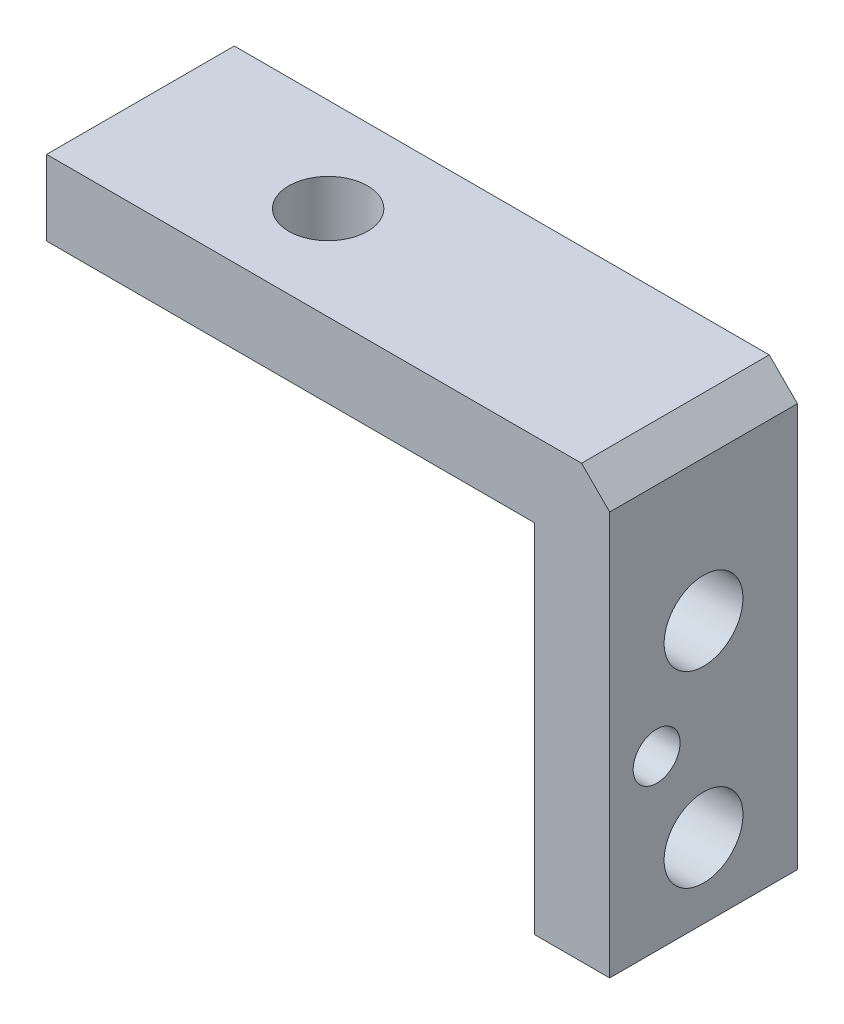
ISO-10303-21;
HEADER;
FILE_DESCRIPTION(('STEP AP214'),'2;1');
FILE_NAME('part.step','',(''),(''),'','','');
FILE_SCHEMA(('AUTOMOTIVE_DESIGN { 1 0 10303 214 1 1 1 1 }'));
ENDSEC;
DATA;
#1=APPLICATION_CONTEXT('core data for automotive mechanical design processes');
#2=APPLICATION_PROTOCOL_DEFINITION('international standard','automotive_design',2000,#1);
#3=PRODUCT_CONTEXT('',#1,'mechanical');
#4=PRODUCT('Part','Part','',(#3));
#5=PRODUCT_RELATED_PRODUCT_CATEGORY('part','',(#4));
#6=PRODUCT_DEFINITION_FORMATION('','',#4);
#7=PRODUCT_DEFINITION_CONTEXT('part definition',#1,'design');
#8=PRODUCT_DEFINITION('design','',#6,#7);
#9=PRODUCT_DEFINITION_SHAPE('','',#8);
#10=(LENGTH_UNIT() NAMED_UNIT(*) SI_UNIT(.MILLI.,.METRE.));
#11=(NAMED_UNIT(*) PLANE_ANGLE_UNIT() SI_UNIT($,.RADIAN.));
#12=(NAMED_UNIT(*) SI_UNIT($,.STERADIAN.) SOLID_ANGLE_UNIT());
#13=UNCERTAINTY_MEASURE_WITH_UNIT(LENGTH_MEASURE(1.E-05),#10,'distance_accuracy_value','');
#14=(GEOMETRIC_REPRESENTATION_CONTEXT(3) GLOBAL_UNCERTAINTY_ASSIGNED_CONTEXT((#13)) GLOBAL_UNIT_ASSIGNED_CONTEXT((#10,
#11,#12)) REPRESENTATION_CONTEXT('',''));
#15=CARTESIAN_POINT('',(0.,0.,0.));
#16=DIRECTION('',(0.,0.,1.));
#17=DIRECTION('',(1.,0.,0.));
#18=AXIS2_PLACEMENT_3D('',#15,#16,#17);
#19=CARTESIAN_POINT('',(-15.,-11.5,5.));
#20=DIRECTION('',(1.,0.,0.));
#21=DIRECTION('',(0.,0.,-1.));
#22=AXIS2_PLACEMENT_3D('',#19,#20,#21);
#23=PLANE('',#22);
#24=DIRECTION('',(0.,-1.,0.));
#25=VECTOR('',#24,1.);
#26=CARTESIAN_POINT('',(-15.,-11.5,-5.));
#27=LINE('',#26,#25);
#28=CARTESIAN_POINT('',(-15.,11.5,-5.));
#29=VERTEX_POINT('',#28);
#30=CARTESIAN_POINT('',(-15.,7.5,-5.));
#31=VERTEX_POINT('',#30);
#32=EDGE_CURVE('E141',#29,#31,#27,.T.);
#33=ORIENTED_EDGE('',*,*,#32,.T.);
#34=DIRECTION('',(0.,0.,1.));
#35=VECTOR('',#34,1.);
#36=CARTESIAN_POINT('',(-15.,7.5,-5.));
#37=LINE('',#36,#35);
#38=CARTESIAN_POINT('',(-15.,7.5,5.));
#39=VERTEX_POINT('',#38);
#40=EDGE_CURVE('E148',#31,#39,#37,.T.);
#41=ORIENTED_EDGE('',*,*,#40,.T.);
#42=DIRECTION('',(0.,-1.,0.));
#43=VECTOR('',#42,1.);
#44=CARTESIAN_POINT('',(-15.,-11.5,5.));
#45=LINE('',#44,#43);
#46=CARTESIAN_POINT('',(-15.,11.5,5.));
#47=VERTEX_POINT('',#46);
#48=EDGE_CURVE('E154',#47,#39,#45,.T.);
#49=ORIENTED_EDGE('',*,*,#48,.F.);
#50=DIRECTION('',(0.,0.,-1.));
#51=VECTOR('',#50,1.);
#52=CARTESIAN_POINT('',(-15.,11.5,5.));
#53=LINE('',#52,#51);
#54=EDGE_CURVE('E155',#47,#29,#53,.T.);
#55=ORIENTED_EDGE('',*,*,#54,.T.);
#56=EDGE_LOOP('',(#33,#41,#49,#55));
#57=FACE_BOUND('',#56,.T.);
#58=ADVANCED_FACE('F43',(#57),#23,.F.);
#59=CARTESIAN_POINT('',(15.,-11.5,5.));
#60=DIRECTION('',(0.,1.,0.));
#61=DIRECTION('',(-1.,0.,0.));
#62=AXIS2_PLACEMENT_3D('',#59,#60,#61);
#63=PLANE('',#62);
#64=DIRECTION('',(1.,0.,0.));
#65=VECTOR('',#64,1.);
#66=CARTESIAN_POINT('',(15.,-11.5,5.));
#67=LINE('',#66,#65);
#68=CARTESIAN_POINT('',(11.,-11.5,5.));
#69=VERTEX_POINT('',#68);
#70=CARTESIAN_POINT('',(15.,-11.5,5.));
#71=VERTEX_POINT('',#70);
#72=EDGE_CURVE('E135',#69,#71,#67,.T.);
#73=ORIENTED_EDGE('',*,*,#72,.F.);
#74=DIRECTION('',(0.,0.,1.));
#75=VECTOR('',#74,1.);
#76=CARTESIAN_POINT('',(11.,-11.5,-5.));
#77=LINE('',#76,#75);
#78=CARTESIAN_POINT('',(11.,-11.5,-5.));
#79=VERTEX_POINT('',#78);
#80=EDGE_CURVE('E120',#79,#69,#77,.T.);
#81=ORIENTED_EDGE('',*,*,#80,.F.);
#82=DIRECTION('',(1.,0.,0.));
#83=VECTOR('',#82,1.);
#84=CARTESIAN_POINT('',(15.,-11.5,-5.));
#85=LINE('',#84,#83);
#86=CARTESIAN_POINT('',(15.,-11.5,-5.));
#87=VERTEX_POINT('',#86);
#88=EDGE_CURVE('E133',#79,#87,#85,.T.);
#89=ORIENTED_EDGE('',*,*,#88,.T.);
#90=DIRECTION('',(0.,0.,-1.));
#91=VECTOR('',#90,1.);
#92=CARTESIAN_POINT('',(15.,-11.5,5.));
#93=LINE('',#92,#91);
#94=EDGE_CURVE('E159',#71,#87,#93,.T.);
#95=ORIENTED_EDGE('',*,*,#94,.F.);
#96=EDGE_LOOP('',(#73,#81,#89,#95));
#97=FACE_BOUND('',#96,.T.);
#98=ADVANCED_FACE('F131',(#97),#63,.F.);
#99=CARTESIAN_POINT('',(15.,-11.5,5.));
#100=DIRECTION('',(-1.,0.,0.));
#101=DIRECTION('',(0.,0.,1.));
#102=AXIS2_PLACEMENT_3D('',#99,#100,#101);
#103=PLANE('',#102);
#104=CARTESIAN_POINT('',(15.,-2.51700000000042,2.5));
#105=DIRECTION('',(1.,0.,0.));
#106=DIRECTION('',(0.,0.,-1.));
#107=AXIS2_PLACEMENT_3D('',#104,#105,#106);
#108=CIRCLE('',#107,1.24999999999999);
#109=CARTESIAN_POINT('',(15.,-2.51700000000042,1.25000000000001));
#110=VERTEX_POINT('',#109);
#111=EDGE_CURVE('E170',#110,#110,#108,.T.);
#112=ORIENTED_EDGE('',*,*,#111,.F.);
#113=EDGE_LOOP('',(#112));
#114=FACE_BOUND('',#113,.T.);
#115=CARTESIAN_POINT('',(15.,-7.51700000000042,0.));
#116=DIRECTION('',(1.,0.,0.));
#117=DIRECTION('',(0.,0.,-1.));
#118=AXIS2_PLACEMENT_3D('',#115,#116,#117);
#119=CIRCLE('',#118,2.1);
#120=CARTESIAN_POINT('',(15.,-7.51700000000042,-2.09999999999995));
#121=VERTEX_POINT('',#120);
#122=EDGE_CURVE('E179',#121,#121,#119,.T.);
#123=ORIENTED_EDGE('',*,*,#122,.F.);
#124=EDGE_LOOP('',(#123));
#125=FACE_BOUND('',#124,.T.);
#126=CARTESIAN_POINT('',(15.,2.48299999999958,0.));
#127=DIRECTION('',(1.,0.,0.));
#128=DIRECTION('',(0.,0.,-1.));
#129=AXIS2_PLACEMENT_3D('',#126,#127,#128);
#130=CIRCLE('',#129,2.1);
#131=CARTESIAN_POINT('',(15.,2.48299999999958,-2.09999999999995));
#132=VERTEX_POINT('',#131);
#133=EDGE_CURVE('E173',#132,#132,#130,.T.);
#134=ORIENTED_EDGE('',*,*,#133,.F.);
#135=EDGE_LOOP('',(#134));
#136=FACE_BOUND('',#135,.T.);
#137=DIRECTION('',(0.,1.,0.));
#138=VECTOR('',#137,1.);
#139=CARTESIAN_POINT('',(15.,-11.5,-5.));
#140=LINE('',#139,#138);
#141=CARTESIAN_POINT('',(15.,9.99999999999999,-5.));
#142=VERTEX_POINT('',#141);
#143=EDGE_CURVE('E139',#87,#142,#140,.T.);
#144=ORIENTED_EDGE('',*,*,#143,.T.);
#145=DIRECTION('',(0.,0.,1.));
#146=VECTOR('',#145,1.);
#147=CARTESIAN_POINT('',(15.,9.99999999999999,5.));
#148=LINE('',#147,#146);
#149=CARTESIAN_POINT('',(15.,9.99999999999999,5.));
#150=VERTEX_POINT('',#149);
#151=EDGE_CURVE('E52',#142,#150,#148,.T.);
#152=ORIENTED_EDGE('',*,*,#151,.T.);
#153=DIRECTION('',(0.,1.,0.));
#154=VECTOR('',#153,1.);
#155=CARTESIAN_POINT('',(15.,-11.5,5.));
#156=LINE('',#155,#154);
#157=EDGE_CURVE('E220',#71,#150,#156,.T.);
#158=ORIENTED_EDGE('',*,*,#157,.F.);
#159=ORIENTED_EDGE('',*,*,#94,.T.);
#160=EDGE_LOOP('',(#144,#152,#158,#159));
#161=FACE_BOUND('',#160,.T.);
#162=ADVANCED_FACE('F237',(#114,#125,#136,#161),#103,.F.);
#163=CARTESIAN_POINT('',(15.,11.5,5.));
#164=DIRECTION('',(0.,-1.,0.));
#165=DIRECTION('',(1.,0.,0.));
#166=AXIS2_PLACEMENT_3D('',#163,#164,#165);
#167=PLANE('',#166);
#168=CARTESIAN_POINT('',(-5.,11.5,0.));
#169=DIRECTION('',(0.,1.,0.));
#170=DIRECTION('',(0.,0.,1.));
#171=AXIS2_PLACEMENT_3D('',#168,#169,#170);
#172=CIRCLE('',#171,2.1);
#173=CARTESIAN_POINT('',(-5.,11.5,2.1));
#174=VERTEX_POINT('',#173);
#175=EDGE_CURVE('E195',#174,#174,#172,.T.);
#176=ORIENTED_EDGE('',*,*,#175,.F.);
#177=EDGE_LOOP('',(#176));
#178=FACE_BOUND('',#177,.T.);
#179=DIRECTION('',(-1.,0.,0.));
#180=VECTOR('',#179,1.);
#181=CARTESIAN_POINT('',(15.,11.5,5.));
#182=LINE('',#181,#180);
#183=CARTESIAN_POINT('',(13.5,11.5,5.));
#184=VERTEX_POINT('',#183);
#185=EDGE_CURVE('E160',#184,#47,#182,.T.);
#186=ORIENTED_EDGE('',*,*,#185,.F.);
#187=DIRECTION('',(0.,0.,-1.));
#188=VECTOR('',#187,1.);
#189=CARTESIAN_POINT('',(13.5,11.5,5.));
#190=LINE('',#189,#188);
#191=CARTESIAN_POINT('',(13.5,11.5,-5.));
#192=VERTEX_POINT('',#191);
#193=EDGE_CURVE('E163',#184,#192,#190,.T.);
#194=ORIENTED_EDGE('',*,*,#193,.T.);
#195=DIRECTION('',(-1.,0.,0.));
#196=VECTOR('',#195,1.);
#197=CARTESIAN_POINT('',(15.,11.5,-5.));
#198=LINE('',#197,#196);
#199=EDGE_CURVE('E144',#192,#29,#198,.T.);
#200=ORIENTED_EDGE('',*,*,#199,.T.);
#201=ORIENTED_EDGE('',*,*,#54,.F.);
#202=EDGE_LOOP('',(#186,#194,#200,#201));
#203=FACE_BOUND('',#202,.T.);
#204=ADVANCED_FACE('F232',(#178,#203),#167,.F.);
#205=CARTESIAN_POINT('',(0.,0.,5.));
#206=DIRECTION('',(0.,0.,1.));
#207=DIRECTION('',(1.,0.,0.));
#208=AXIS2_PLACEMENT_3D('',#205,#206,#207);
#209=PLANE('',#208);
#210=ORIENTED_EDGE('',*,*,#157,.T.);
#211=DIRECTION('',(0.707106781186546,-0.707106781186549,0.));
#212=VECTOR('',#211,1.);
#213=CARTESIAN_POINT('',(12.5,12.5,5.));
#214=LINE('',#213,#212);
#215=EDGE_CURVE('E11',#150,#184,#214,.F.);
#216=ORIENTED_EDGE('',*,*,#215,.T.);
#217=ORIENTED_EDGE('',*,*,#185,.T.);
#218=ORIENTED_EDGE('',*,*,#48,.T.);
#219=DIRECTION('',(-1.,0.,0.));
#220=VECTOR('',#219,1.);
#221=CARTESIAN_POINT('',(-15.,7.5,5.));
#222=LINE('',#221,#220);
#223=CARTESIAN_POINT('',(11.,7.5,5.));
#224=VERTEX_POINT('',#223);
#225=EDGE_CURVE('E127',#224,#39,#222,.T.);
#226=ORIENTED_EDGE('',*,*,#225,.F.);
#227=DIRECTION('',(0.,1.,0.));
#228=VECTOR('',#227,1.);
#229=CARTESIAN_POINT('',(11.,-11.5,5.));
#230=LINE('',#229,#228);
#231=EDGE_CURVE('E202',#69,#224,#230,.T.);
#232=ORIENTED_EDGE('',*,*,#231,.F.);
#233=ORIENTED_EDGE('',*,*,#72,.T.);
#234=EDGE_LOOP('',(#210,#216,#217,#218,#226,#232,#233));
#235=FACE_BOUND('',#234,.T.);
#236=ADVANCED_FACE('F226',(#235),#209,.T.);
#237=CARTESIAN_POINT('',(0.,0.,-5.));
#238=DIRECTION('',(0.,0.,1.));
#239=DIRECTION('',(1.,0.,0.));
#240=AXIS2_PLACEMENT_3D('',#237,#238,#239);
#241=PLANE('',#240);
#242=ORIENTED_EDGE('',*,*,#199,.F.);
#243=DIRECTION('',(-0.707106781186546,0.707106781186549,0.));
#244=VECTOR('',#243,1.);
#245=CARTESIAN_POINT('',(13.5,11.5,-5.));
#246=LINE('',#245,#244);
#247=EDGE_CURVE('E71',#192,#142,#246,.F.);
#248=ORIENTED_EDGE('',*,*,#247,.T.);
#249=ORIENTED_EDGE('',*,*,#143,.F.);
#250=ORIENTED_EDGE('',*,*,#88,.F.);
#251=DIRECTION('',(0.,1.,0.));
#252=VECTOR('',#251,1.);
#253=CARTESIAN_POINT('',(11.,-11.5,-5.));
#254=LINE('',#253,#252);
#255=CARTESIAN_POINT('',(11.,7.5,-5.));
#256=VERTEX_POINT('',#255);
#257=EDGE_CURVE('E116',#79,#256,#254,.T.);
#258=ORIENTED_EDGE('',*,*,#257,.T.);
#259=DIRECTION('',(-1.,0.,0.));
#260=VECTOR('',#259,1.);
#261=CARTESIAN_POINT('',(-15.,7.5,-5.));
#262=LINE('',#261,#260);
#263=EDGE_CURVE('E126',#256,#31,#262,.T.);
#264=ORIENTED_EDGE('',*,*,#263,.T.);
#265=ORIENTED_EDGE('',*,*,#32,.F.);
#266=EDGE_LOOP('',(#242,#248,#249,#250,#258,#264,#265));
#267=FACE_BOUND('',#266,.T.);
#268=ADVANCED_FACE('F138',(#267),#241,.F.);
#269=CARTESIAN_POINT('',(-15.,7.5,-5.));
#270=DIRECTION('',(0.,1.,0.));
#271=DIRECTION('',(0.,0.,1.));
#272=AXIS2_PLACEMENT_3D('',#269,#270,#271);
#273=PLANE('',#272);
#274=CARTESIAN_POINT('',(-5.,7.5,0.));
#275=DIRECTION('',(0.,1.,0.));
#276=DIRECTION('',(0.,0.,1.));
#277=AXIS2_PLACEMENT_3D('',#274,#275,#276);
#278=CIRCLE('',#277,2.1);
#279=CARTESIAN_POINT('',(-5.,7.5,2.1));
#280=VERTEX_POINT('',#279);
#281=EDGE_CURVE('E199',#280,#280,#278,.T.);
#282=ORIENTED_EDGE('',*,*,#281,.T.);
#283=EDGE_LOOP('',(#282));
#284=FACE_BOUND('',#283,.T.);
#285=ORIENTED_EDGE('',*,*,#225,.T.);
#286=ORIENTED_EDGE('',*,*,#40,.F.);
#287=ORIENTED_EDGE('',*,*,#263,.F.);
#288=DIRECTION('',(0.,0.,1.));
#289=VECTOR('',#288,1.);
#290=CARTESIAN_POINT('',(11.,7.5,-5.));
#291=LINE('',#290,#289);
#292=EDGE_CURVE('E122',#256,#224,#291,.T.);
#293=ORIENTED_EDGE('',*,*,#292,.T.);
#294=EDGE_LOOP('',(#285,#286,#287,#293));
#295=FACE_BOUND('',#294,.T.);
#296=ADVANCED_FACE('F236',(#284,#295),#273,.F.);
#297=CARTESIAN_POINT('',(11.,-11.5,-5.));
#298=DIRECTION('',(1.,0.,0.));
#299=DIRECTION('',(0.,0.,-1.));
#300=AXIS2_PLACEMENT_3D('',#297,#298,#299);
#301=PLANE('',#300);
#302=CARTESIAN_POINT('',(11.,-2.51700000000042,2.5));
#303=DIRECTION('',(1.,0.,0.));
#304=DIRECTION('',(0.,0.,-1.));
#305=AXIS2_PLACEMENT_3D('',#302,#303,#304);
#306=CIRCLE('',#305,1.24999999999999);
#307=CARTESIAN_POINT('',(11.,-2.51700000000042,1.25000000000001));
#308=VERTEX_POINT('',#307);
#309=EDGE_CURVE('E181',#308,#308,#306,.T.);
#310=ORIENTED_EDGE('',*,*,#309,.T.);
#311=EDGE_LOOP('',(#310));
#312=FACE_BOUND('',#311,.T.);
#313=CARTESIAN_POINT('',(11.,-7.51700000000042,0.));
#314=DIRECTION('',(1.,0.,0.));
#315=DIRECTION('',(0.,0.,-1.));
#316=AXIS2_PLACEMENT_3D('',#313,#314,#315);
#317=CIRCLE('',#316,2.1);
#318=CARTESIAN_POINT('',(11.,-7.51700000000042,-2.09999999999994));
#319=VERTEX_POINT('',#318);
#320=EDGE_CURVE('E177',#319,#319,#317,.T.);
#321=ORIENTED_EDGE('',*,*,#320,.T.);
#322=EDGE_LOOP('',(#321));
#323=FACE_BOUND('',#322,.T.);
#324=CARTESIAN_POINT('',(11.,2.48299999999958,0.));
#325=DIRECTION('',(1.,0.,0.));
#326=DIRECTION('',(0.,0.,-1.));
#327=AXIS2_PLACEMENT_3D('',#324,#325,#326);
#328=CIRCLE('',#327,2.1);
#329=CARTESIAN_POINT('',(11.,2.48299999999958,-2.09999999999994));
#330=VERTEX_POINT('',#329);
#331=EDGE_CURVE('E176',#330,#330,#328,.T.);
#332=ORIENTED_EDGE('',*,*,#331,.T.);
#333=EDGE_LOOP('',(#332));
#334=FACE_BOUND('',#333,.T.);
#335=ORIENTED_EDGE('',*,*,#231,.T.);
#336=ORIENTED_EDGE('',*,*,#292,.F.);
#337=ORIENTED_EDGE('',*,*,#257,.F.);
#338=ORIENTED_EDGE('',*,*,#80,.T.);
#339=EDGE_LOOP('',(#335,#336,#337,#338));
#340=FACE_BOUND('',#339,.T.);
#341=ADVANCED_FACE('F119',(#312,#323,#334,#340),#301,.F.);
#342=CARTESIAN_POINT('',(13.5,11.5,5.));
#343=DIRECTION('',(-0.707106781186549,-0.707106781186546,0.));
#344=DIRECTION('',(0.,0.,-1.));
#345=AXIS2_PLACEMENT_3D('',#342,#343,#344);
#346=PLANE('',#345);
#347=ORIENTED_EDGE('',*,*,#215,.F.);
#348=ORIENTED_EDGE('',*,*,#151,.F.);
#349=ORIENTED_EDGE('',*,*,#247,.F.);
#350=ORIENTED_EDGE('',*,*,#193,.F.);
#351=EDGE_LOOP('',(#347,#348,#349,#350));
#352=FACE_BOUND('',#351,.T.);
#353=ADVANCED_FACE('F45',(#352),#346,.F.);
#354=CARTESIAN_POINT('',(-5.,11.5,0.));
#355=DIRECTION('',(0.,1.,0.));
#356=DIRECTION('',(0.,0.,1.));
#357=AXIS2_PLACEMENT_3D('',#354,#355,#356);
#358=CYLINDRICAL_SURFACE('',#357,2.1);
#359=ORIENTED_EDGE('',*,*,#175,.T.);
#360=EDGE_LOOP('',(#359));
#361=FACE_BOUND('',#360,.T.);
#362=ORIENTED_EDGE('',*,*,#281,.F.);
#363=EDGE_LOOP('',(#362));
#364=FACE_BOUND('',#363,.T.);
#365=ADVANCED_FACE('F287',(#361,#364),#358,.F.);
#366=CARTESIAN_POINT('',(15.,2.48299999999958,0.));
#367=DIRECTION('',(1.,0.,0.));
#368=DIRECTION('',(0.,0.,-1.));
#369=AXIS2_PLACEMENT_3D('',#366,#367,#368);
#370=CYLINDRICAL_SURFACE('',#369,2.1);
#371=ORIENTED_EDGE('',*,*,#133,.T.);
#372=EDGE_LOOP('',(#371));
#373=FACE_BOUND('',#372,.T.);
#374=ORIENTED_EDGE('',*,*,#331,.F.);
#375=EDGE_LOOP('',(#374));
#376=FACE_BOUND('',#375,.T.);
#377=ADVANCED_FACE('F311',(#373,#376),#370,.F.);
#378=CARTESIAN_POINT('',(15.,-7.51700000000042,0.));
#379=DIRECTION('',(1.,0.,0.));
#380=DIRECTION('',(0.,0.,-1.));
#381=AXIS2_PLACEMENT_3D('',#378,#379,#380);
#382=CYLINDRICAL_SURFACE('',#381,2.1);
#383=ORIENTED_EDGE('',*,*,#122,.T.);
#384=EDGE_LOOP('',(#383));
#385=FACE_BOUND('',#384,.T.);
#386=ORIENTED_EDGE('',*,*,#320,.F.);
#387=EDGE_LOOP('',(#386));
#388=FACE_BOUND('',#387,.T.);
#389=ADVANCED_FACE('F322',(#385,#388),#382,.F.);
#390=CARTESIAN_POINT('',(15.,-2.51700000000042,2.5));
#391=DIRECTION('',(1.,0.,0.));
#392=DIRECTION('',(0.,0.,-1.));
#393=AXIS2_PLACEMENT_3D('',#390,#391,#392);
#394=CYLINDRICAL_SURFACE('',#393,1.24999999999999);
#395=ORIENTED_EDGE('',*,*,#111,.T.);
#396=EDGE_LOOP('',(#395));
#397=FACE_BOUND('',#396,.T.);
#398=ORIENTED_EDGE('',*,*,#309,.F.);
#399=EDGE_LOOP('',(#398));
#400=FACE_BOUND('',#399,.T.);
#401=ADVANCED_FACE('F331',(#397,#400),#394,.F.);
#402=CLOSED_SHELL('',(#58,#98,#162,#204,#236,#268,#296,#341,#353,#365,#377,#389,#401));
#403=MANIFOLD_SOLID_BREP('B2',#402);
#404=ADVANCED_BREP_SHAPE_REPRESENTATION('',(#18,#403),#14);
#405=SHAPE_DEFINITION_REPRESENTATION(#9,#404);
ENDSEC;
END-ISO-10303-21;
